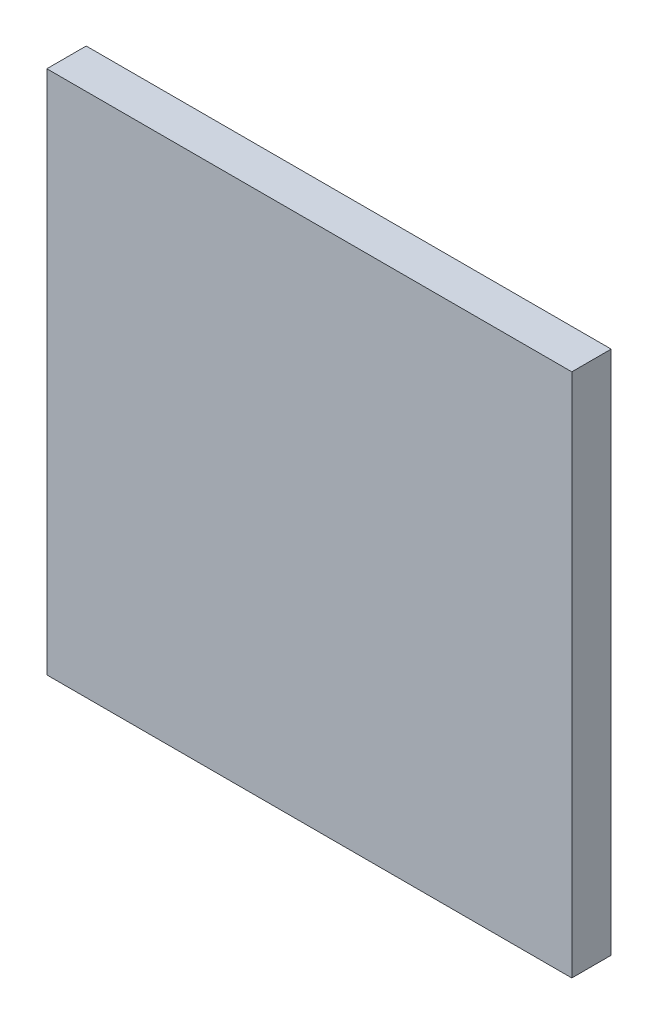
ISO-10303-21;
HEADER;
FILE_DESCRIPTION(('STEP AP214'),'2;1');
FILE_NAME('part.step','',(''),(''),'','','');
FILE_SCHEMA(('AUTOMOTIVE_DESIGN { 1 0 10303 214 1 1 1 1 }'));
ENDSEC;
DATA;
#1=APPLICATION_CONTEXT('core data for automotive mechanical design processes');
#2=APPLICATION_PROTOCOL_DEFINITION('international standard','automotive_design',2000,#1);
#3=PRODUCT_CONTEXT('',#1,'mechanical');
#4=PRODUCT('Part','Part','',(#3));
#5=PRODUCT_RELATED_PRODUCT_CATEGORY('part','',(#4));
#6=PRODUCT_DEFINITION_FORMATION('','',#4);
#7=PRODUCT_DEFINITION_CONTEXT('part definition',#1,'design');
#8=PRODUCT_DEFINITION('design','',#6,#7);
#9=PRODUCT_DEFINITION_SHAPE('','',#8);
#10=(LENGTH_UNIT() NAMED_UNIT(*) SI_UNIT(.MILLI.,.METRE.));
#11=(NAMED_UNIT(*) PLANE_ANGLE_UNIT() SI_UNIT($,.RADIAN.));
#12=(NAMED_UNIT(*) SI_UNIT($,.STERADIAN.) SOLID_ANGLE_UNIT());
#13=UNCERTAINTY_MEASURE_WITH_UNIT(LENGTH_MEASURE(1.E-05),#10,'distance_accuracy_value','');
#14=(GEOMETRIC_REPRESENTATION_CONTEXT(3) GLOBAL_UNCERTAINTY_ASSIGNED_CONTEXT((#13)) GLOBAL_UNIT_ASSIGNED_CONTEXT((#10,
#11,#12)) REPRESENTATION_CONTEXT('',''));
#15=CARTESIAN_POINT('',(0.,0.,0.));
#16=DIRECTION('',(0.,0.,1.));
#17=DIRECTION('',(1.,0.,0.));
#18=AXIS2_PLACEMENT_3D('',#15,#16,#17);
#19=CARTESIAN_POINT('',(-6.999986,-7.0000114,1.0500106));
#20=DIRECTION('',(1.,0.,0.));
#21=DIRECTION('',(0.,0.,-1.));
#22=AXIS2_PLACEMENT_3D('',#19,#20,#21);
#23=PLANE('',#22);
#24=DIRECTION('',(0.,-1.,0.));
#25=VECTOR('',#24,1.);
#26=CARTESIAN_POINT('',(-6.999986,-7.0000114,0.));
#27=LINE('',#26,#25);
#28=CARTESIAN_POINT('',(-6.999986,6.999986,0.));
#29=VERTEX_POINT('',#28);
#30=CARTESIAN_POINT('',(-6.999986,-7.0000114,0.));
#31=VERTEX_POINT('',#30);
#32=EDGE_CURVE('E95',#29,#31,#27,.T.);
#33=ORIENTED_EDGE('',*,*,#32,.T.);
#34=DIRECTION('',(0.,0.,-1.));
#35=VECTOR('',#34,1.);
#36=CARTESIAN_POINT('',(-6.999986,-7.0000114,1.0500106));
#37=LINE('',#36,#35);
#38=CARTESIAN_POINT('',(-6.999986,-7.0000114,1.0500106));
#39=VERTEX_POINT('',#38);
#40=EDGE_CURVE('E11',#39,#31,#37,.T.);
#41=ORIENTED_EDGE('',*,*,#40,.F.);
#42=DIRECTION('',(0.,-1.,0.));
#43=VECTOR('',#42,1.);
#44=CARTESIAN_POINT('',(-6.999986,-7.0000114,1.0500106));
#45=LINE('',#44,#43);
#46=CARTESIAN_POINT('',(-6.999986,6.999986,1.0500106));
#47=VERTEX_POINT('',#46);
#48=EDGE_CURVE('E83',#47,#39,#45,.T.);
#49=ORIENTED_EDGE('',*,*,#48,.F.);
#50=DIRECTION('',(0.,0.,-1.));
#51=VECTOR('',#50,1.);
#52=CARTESIAN_POINT('',(-6.999986,6.999986,1.0500106));
#53=LINE('',#52,#51);
#54=EDGE_CURVE('E91',#47,#29,#53,.T.);
#55=ORIENTED_EDGE('',*,*,#54,.T.);
#56=EDGE_LOOP('',(#33,#41,#49,#55));
#57=FACE_BOUND('',#56,.T.);
#58=ADVANCED_FACE('F32',(#57),#23,.F.);
#59=CARTESIAN_POINT('',(7.0000114,-7.0000114,1.0500106));
#60=DIRECTION('',(0.,1.,0.));
#61=DIRECTION('',(0.,0.,1.));
#62=AXIS2_PLACEMENT_3D('',#59,#60,#61);
#63=PLANE('',#62);
#64=DIRECTION('',(1.,0.,0.));
#65=VECTOR('',#64,1.);
#66=CARTESIAN_POINT('',(7.0000114,-7.0000114,0.));
#67=LINE('',#66,#65);
#68=CARTESIAN_POINT('',(7.0000114,-7.0000114,0.));
#69=VERTEX_POINT('',#68);
#70=EDGE_CURVE('E87',#31,#69,#67,.T.);
#71=ORIENTED_EDGE('',*,*,#70,.T.);
#72=DIRECTION('',(0.,0.,-1.));
#73=VECTOR('',#72,1.);
#74=CARTESIAN_POINT('',(7.0000114,-7.0000114,1.0500106));
#75=LINE('',#74,#73);
#76=CARTESIAN_POINT('',(7.0000114,-7.0000114,1.0500106));
#77=VERTEX_POINT('',#76);
#78=EDGE_CURVE('E40',#77,#69,#75,.T.);
#79=ORIENTED_EDGE('',*,*,#78,.F.);
#80=DIRECTION('',(1.,0.,0.));
#81=VECTOR('',#80,1.);
#82=CARTESIAN_POINT('',(7.0000114,-7.0000114,1.0500106));
#83=LINE('',#82,#81);
#84=EDGE_CURVE('E78',#39,#77,#83,.T.);
#85=ORIENTED_EDGE('',*,*,#84,.F.);
#86=ORIENTED_EDGE('',*,*,#40,.T.);
#87=EDGE_LOOP('',(#71,#79,#85,#86));
#88=FACE_BOUND('',#87,.T.);
#89=ADVANCED_FACE('F86',(#88),#63,.F.);
#90=CARTESIAN_POINT('',(7.0000114,6.999986,1.0500106));
#91=DIRECTION('',(-1.,0.,0.));
#92=DIRECTION('',(0.,0.,1.));
#93=AXIS2_PLACEMENT_3D('',#90,#91,#92);
#94=PLANE('',#93);
#95=DIRECTION('',(0.,1.,0.));
#96=VECTOR('',#95,1.);
#97=CARTESIAN_POINT('',(7.0000114,6.999986,0.));
#98=LINE('',#97,#96);
#99=CARTESIAN_POINT('',(7.0000114,6.999986,0.));
#100=VERTEX_POINT('',#99);
#101=EDGE_CURVE('E65',#69,#100,#98,.T.);
#102=ORIENTED_EDGE('',*,*,#101,.T.);
#103=DIRECTION('',(0.,0.,-1.));
#104=VECTOR('',#103,1.);
#105=CARTESIAN_POINT('',(7.0000114,6.999986,1.0500106));
#106=LINE('',#105,#104);
#107=CARTESIAN_POINT('',(7.0000114,6.999986,1.0500106));
#108=VERTEX_POINT('',#107);
#109=EDGE_CURVE('E88',#108,#100,#106,.T.);
#110=ORIENTED_EDGE('',*,*,#109,.F.);
#111=DIRECTION('',(0.,1.,0.));
#112=VECTOR('',#111,1.);
#113=CARTESIAN_POINT('',(7.0000114,6.999986,1.0500106));
#114=LINE('',#113,#112);
#115=EDGE_CURVE('E81',#77,#108,#114,.T.);
#116=ORIENTED_EDGE('',*,*,#115,.F.);
#117=ORIENTED_EDGE('',*,*,#78,.T.);
#118=EDGE_LOOP('',(#102,#110,#116,#117));
#119=FACE_BOUND('',#118,.T.);
#120=ADVANCED_FACE('F89',(#119),#94,.F.);
#121=CARTESIAN_POINT('',(-6.999986,6.999986,1.0500106));
#122=DIRECTION('',(0.,-1.,0.));
#123=DIRECTION('',(0.,0.,-1.));
#124=AXIS2_PLACEMENT_3D('',#121,#122,#123);
#125=PLANE('',#124);
#126=DIRECTION('',(-1.,0.,0.));
#127=VECTOR('',#126,1.);
#128=CARTESIAN_POINT('',(-6.999986,6.999986,0.));
#129=LINE('',#128,#127);
#130=EDGE_CURVE('E71',#100,#29,#129,.T.);
#131=ORIENTED_EDGE('',*,*,#130,.T.);
#132=ORIENTED_EDGE('',*,*,#54,.F.);
#133=DIRECTION('',(-1.,0.,0.));
#134=VECTOR('',#133,1.);
#135=CARTESIAN_POINT('',(-6.999986,6.999986,1.0500106));
#136=LINE('',#135,#134);
#137=EDGE_CURVE('E48',#108,#47,#136,.T.);
#138=ORIENTED_EDGE('',*,*,#137,.F.);
#139=ORIENTED_EDGE('',*,*,#109,.T.);
#140=EDGE_LOOP('',(#131,#132,#138,#139));
#141=FACE_BOUND('',#140,.T.);
#142=ADVANCED_FACE('F102',(#141),#125,.F.);
#143=CARTESIAN_POINT('',(0.,0.,1.0500106));
#144=DIRECTION('',(0.,0.,-1.));
#145=DIRECTION('',(-1.,0.,0.));
#146=AXIS2_PLACEMENT_3D('',#143,#144,#145);
#147=PLANE('',#146);
#148=ORIENTED_EDGE('',*,*,#48,.T.);
#149=ORIENTED_EDGE('',*,*,#84,.T.);
#150=ORIENTED_EDGE('',*,*,#115,.T.);
#151=ORIENTED_EDGE('',*,*,#137,.T.);
#152=EDGE_LOOP('',(#148,#149,#150,#151));
#153=FACE_BOUND('',#152,.T.);
#154=ADVANCED_FACE('F79',(#153),#147,.F.);
#155=CARTESIAN_POINT('',(0.,0.,0.));
#156=DIRECTION('',(0.,0.,-1.));
#157=DIRECTION('',(-1.,0.,0.));
#158=AXIS2_PLACEMENT_3D('',#155,#156,#157);
#159=PLANE('',#158);
#160=ORIENTED_EDGE('',*,*,#32,.F.);
#161=ORIENTED_EDGE('',*,*,#130,.F.);
#162=ORIENTED_EDGE('',*,*,#101,.F.);
#163=ORIENTED_EDGE('',*,*,#70,.F.);
#164=EDGE_LOOP('',(#160,#161,#162,#163));
#165=FACE_BOUND('',#164,.T.);
#166=ADVANCED_FACE('F105',(#165),#159,.T.);
#167=CLOSED_SHELL('',(#58,#89,#120,#142,#154,#166));
#168=MANIFOLD_SOLID_BREP('B2',#167);
#169=ADVANCED_BREP_SHAPE_REPRESENTATION('',(#18,#168),#14);
#170=SHAPE_DEFINITION_REPRESENTATION(#9,#169);
ENDSEC;
END-ISO-10303-21;
